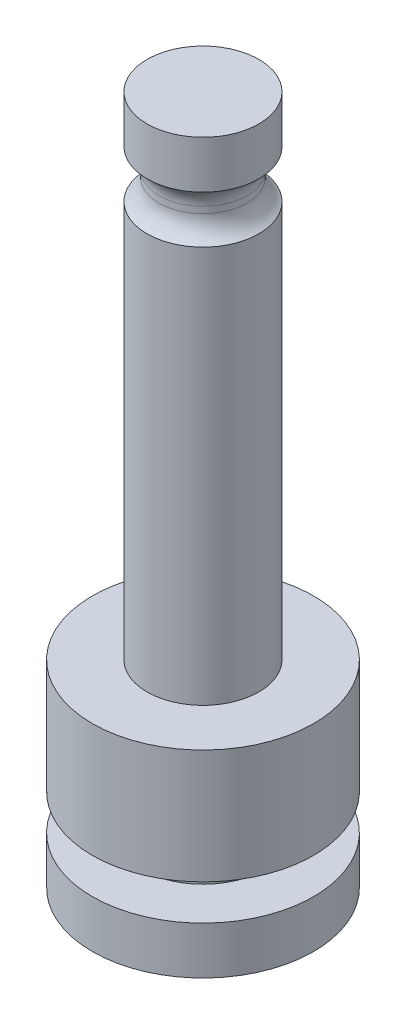
ISO-10303-21;
HEADER;
FILE_DESCRIPTION(('STEP AP214'),'2;1');
FILE_NAME('part.step','',(''),(''),'','','');
FILE_SCHEMA(('AUTOMOTIVE_DESIGN { 1 0 10303 214 1 1 1 1 }'));
ENDSEC;
DATA;
#1=APPLICATION_CONTEXT('core data for automotive mechanical design processes');
#2=APPLICATION_PROTOCOL_DEFINITION('international standard','automotive_design',2000,#1);
#3=PRODUCT_CONTEXT('',#1,'mechanical');
#4=PRODUCT('Part','Part','',(#3));
#5=PRODUCT_RELATED_PRODUCT_CATEGORY('part','',(#4));
#6=PRODUCT_DEFINITION_FORMATION('','',#4);
#7=PRODUCT_DEFINITION_CONTEXT('part definition',#1,'design');
#8=PRODUCT_DEFINITION('design','',#6,#7);
#9=PRODUCT_DEFINITION_SHAPE('','',#8);
#10=(LENGTH_UNIT() NAMED_UNIT(*) SI_UNIT(.MILLI.,.METRE.));
#11=(NAMED_UNIT(*) PLANE_ANGLE_UNIT() SI_UNIT($,.RADIAN.));
#12=(NAMED_UNIT(*) SI_UNIT($,.STERADIAN.) SOLID_ANGLE_UNIT());
#13=UNCERTAINTY_MEASURE_WITH_UNIT(LENGTH_MEASURE(1.E-05),#10,'distance_accuracy_value','');
#14=(GEOMETRIC_REPRESENTATION_CONTEXT(3) GLOBAL_UNCERTAINTY_ASSIGNED_CONTEXT((#13)) GLOBAL_UNIT_ASSIGNED_CONTEXT((#10,
#11,#12)) REPRESENTATION_CONTEXT('',''));
#15=CARTESIAN_POINT('',(0.,0.,0.));
#16=DIRECTION('',(0.,0.,1.));
#17=DIRECTION('',(1.,0.,0.));
#18=AXIS2_PLACEMENT_3D('',#15,#16,#17);
#19=CARTESIAN_POINT('',(0.,-4.,0.));
#20=DIRECTION('',(0.,1.,0.));
#21=DIRECTION('',(0.,0.,1.));
#22=AXIS2_PLACEMENT_3D('',#19,#20,#21);
#23=CYLINDRICAL_SURFACE('',#22,4.65);
#24=CARTESIAN_POINT('',(0.,4.3,0.));
#25=DIRECTION('',(0.,1.,0.));
#26=DIRECTION('',(0.,0.,1.));
#27=AXIS2_PLACEMENT_3D('',#24,#25,#26);
#28=CIRCLE('',#27,4.65);
#29=CARTESIAN_POINT('',(0.,4.3,4.65));
#30=VERTEX_POINT('',#29);
#31=EDGE_CURVE('E67',#30,#30,#28,.T.);
#32=ORIENTED_EDGE('',*,*,#31,.F.);
#33=EDGE_LOOP('',(#32));
#34=FACE_BOUND('',#33,.T.);
#35=CARTESIAN_POINT('',(0.,-0.5,0.));
#36=DIRECTION('',(0.,-1.,0.));
#37=DIRECTION('',(0.,0.,-1.));
#38=AXIS2_PLACEMENT_3D('',#35,#36,#37);
#39=CIRCLE('',#38,4.65);
#40=CARTESIAN_POINT('',(0.,-0.5,-4.65));
#41=VERTEX_POINT('',#40);
#42=EDGE_CURVE('E80',#41,#41,#39,.T.);
#43=ORIENTED_EDGE('',*,*,#42,.F.);
#44=EDGE_LOOP('',(#43));
#45=FACE_BOUND('',#44,.T.);
#46=ADVANCED_FACE('F43',(#34,#45),#23,.T.);
#47=CARTESIAN_POINT('',(0.,24.98,0.));
#48=DIRECTION('',(0.,-1.,0.));
#49=DIRECTION('',(0.,0.,-1.));
#50=AXIS2_PLACEMENT_3D('',#47,#48,#49);
#51=CYLINDRICAL_SURFACE('',#50,2.35);
#52=CARTESIAN_POINT('',(0.,4.3,0.));
#53=DIRECTION('',(0.,1.,0.));
#54=DIRECTION('',(0.,0.,1.));
#55=AXIS2_PLACEMENT_3D('',#52,#53,#54);
#56=CIRCLE('',#55,2.35);
#57=CARTESIAN_POINT('',(0.,4.3,2.35));
#58=VERTEX_POINT('',#57);
#59=EDGE_CURVE('E56',#58,#58,#56,.T.);
#60=ORIENTED_EDGE('',*,*,#59,.T.);
#61=EDGE_LOOP('',(#60));
#62=FACE_BOUND('',#61,.T.);
#63=CARTESIAN_POINT('',(0.,20.98,0.));
#64=DIRECTION('',(0.,1.,0.));
#65=DIRECTION('',(0.,0.,1.));
#66=AXIS2_PLACEMENT_3D('',#63,#64,#65);
#67=CIRCLE('',#66,2.35);
#68=CARTESIAN_POINT('',(0.,20.98,2.35));
#69=VERTEX_POINT('',#68);
#70=EDGE_CURVE('E75',#69,#69,#67,.T.);
#71=ORIENTED_EDGE('',*,*,#70,.F.);
#72=EDGE_LOOP('',(#71));
#73=FACE_BOUND('',#72,.T.);
#74=ADVANCED_FACE('F112',(#62,#73),#51,.T.);
#75=CARTESIAN_POINT('',(0.,4.3,0.));
#76=DIRECTION('',(0.,1.,0.));
#77=DIRECTION('',(0.,0.,1.));
#78=AXIS2_PLACEMENT_3D('',#75,#76,#77);
#79=PLANE('',#78);
#80=ORIENTED_EDGE('',*,*,#59,.F.);
#81=EDGE_LOOP('',(#80));
#82=FACE_BOUND('',#81,.T.);
#83=ORIENTED_EDGE('',*,*,#31,.T.);
#84=EDGE_LOOP('',(#83));
#85=FACE_BOUND('',#84,.T.);
#86=ADVANCED_FACE('F120',(#82,#85),#79,.T.);
#87=CARTESIAN_POINT('',(0.,20.98,0.));
#88=DIRECTION('',(0.,1.,0.));
#89=DIRECTION('',(0.,0.,1.));
#90=AXIS2_PLACEMENT_3D('',#87,#88,#89);
#91=CYLINDRICAL_SURFACE('',#90,1.85);
#92=CARTESIAN_POINT('',(0.,21.8460254037844,0.));
#93=DIRECTION('',(0.,-1.,0.));
#94=DIRECTION('',(0.,0.,-1.));
#95=AXIS2_PLACEMENT_3D('',#92,#93,#94);
#96=CIRCLE('',#95,1.85);
#97=CARTESIAN_POINT('',(0.,21.8460254037844,-1.85));
#98=VERTEX_POINT('',#97);
#99=EDGE_CURVE('E10',#98,#98,#96,.F.);
#100=ORIENTED_EDGE('',*,*,#99,.T.);
#101=EDGE_LOOP('',(#100));
#102=FACE_BOUND('',#101,.T.);
#103=CARTESIAN_POINT('',(0.,22.1139745962156,0.));
#104=DIRECTION('',(0.,1.,0.));
#105=DIRECTION('',(0.,0.,1.));
#106=AXIS2_PLACEMENT_3D('',#103,#104,#105);
#107=CIRCLE('',#106,1.85);
#108=CARTESIAN_POINT('',(0.,22.1139745962156,1.85));
#109=VERTEX_POINT('',#108);
#110=EDGE_CURVE('E51',#109,#109,#107,.F.);
#111=ORIENTED_EDGE('',*,*,#110,.T.);
#112=EDGE_LOOP('',(#111));
#113=FACE_BOUND('',#112,.T.);
#114=ADVANCED_FACE('F148',(#102,#113),#91,.T.);
#115=CARTESIAN_POINT('',(0.,24.98,0.));
#116=DIRECTION('',(0.,1.,0.));
#117=DIRECTION('',(0.,0.,1.));
#118=AXIS2_PLACEMENT_3D('',#115,#116,#117);
#119=PLANE('',#118);
#120=CARTESIAN_POINT('',(0.,24.98,0.));
#121=DIRECTION('',(0.,1.,0.));
#122=DIRECTION('',(0.,0.,1.));
#123=AXIS2_PLACEMENT_3D('',#120,#121,#122);
#124=CIRCLE('',#123,2.35);
#125=CARTESIAN_POINT('',(0.,24.98,2.35));
#126=VERTEX_POINT('',#125);
#127=EDGE_CURVE('E70',#126,#126,#124,.T.);
#128=ORIENTED_EDGE('',*,*,#127,.T.);
#129=EDGE_LOOP('',(#128));
#130=FACE_BOUND('',#129,.T.);
#131=ADVANCED_FACE('F150',(#130),#119,.T.);
#132=CARTESIAN_POINT('',(0.,22.98,0.));
#133=DIRECTION('',(0.,1.,0.));
#134=DIRECTION('',(0.,0.,1.));
#135=AXIS2_PLACEMENT_3D('',#132,#133,#134);
#136=CIRCLE('',#135,2.35);
#137=CARTESIAN_POINT('',(0.,22.98,2.35));
#138=VERTEX_POINT('',#137);
#139=EDGE_CURVE('E76',#138,#138,#136,.T.);
#140=ORIENTED_EDGE('',*,*,#139,.T.);
#141=EDGE_LOOP('',(#140));
#142=FACE_BOUND('',#141,.T.);
#143=ORIENTED_EDGE('',*,*,#127,.F.);
#144=EDGE_LOOP('',(#143));
#145=FACE_BOUND('',#144,.T.);
#146=ADVANCED_FACE('F107',(#142,#145),#51,.T.);
#147=CARTESIAN_POINT('',(0.,-0.5,0.));
#148=DIRECTION('',(0.,-1.,0.));
#149=DIRECTION('',(0.,0.,-1.));
#150=AXIS2_PLACEMENT_3D('',#147,#148,#149);
#151=PLANE('',#150);
#152=CARTESIAN_POINT('',(0.,-0.5,0.));
#153=DIRECTION('',(0.,-1.,0.));
#154=DIRECTION('',(0.,0.,-1.));
#155=AXIS2_PLACEMENT_3D('',#152,#153,#154);
#156=CIRCLE('',#155,2.65);
#157=CARTESIAN_POINT('',(0.,-0.5,-2.65));
#158=VERTEX_POINT('',#157);
#159=EDGE_CURVE('E88',#158,#158,#156,.T.);
#160=ORIENTED_EDGE('',*,*,#159,.F.);
#161=EDGE_LOOP('',(#160));
#162=FACE_BOUND('',#161,.T.);
#163=ORIENTED_EDGE('',*,*,#42,.T.);
#164=EDGE_LOOP('',(#163));
#165=FACE_BOUND('',#164,.T.);
#166=ADVANCED_FACE('F103',(#162,#165),#151,.T.);
#167=CARTESIAN_POINT('',(0.,-2.,0.));
#168=DIRECTION('',(0.,-1.,0.));
#169=DIRECTION('',(0.,0.,-1.));
#170=AXIS2_PLACEMENT_3D('',#167,#168,#169);
#171=PLANE('',#170);
#172=CARTESIAN_POINT('',(0.,-2.,0.));
#173=DIRECTION('',(0.,-1.,0.));
#174=DIRECTION('',(0.,0.,-1.));
#175=AXIS2_PLACEMENT_3D('',#172,#173,#174);
#176=CIRCLE('',#175,2.65);
#177=CARTESIAN_POINT('',(0.,-2.,-2.65));
#178=VERTEX_POINT('',#177);
#179=EDGE_CURVE('E92',#178,#178,#176,.T.);
#180=ORIENTED_EDGE('',*,*,#179,.T.);
#181=EDGE_LOOP('',(#180));
#182=FACE_BOUND('',#181,.T.);
#183=CARTESIAN_POINT('',(0.,-2.,0.));
#184=DIRECTION('',(0.,-1.,0.));
#185=DIRECTION('',(0.,0.,-1.));
#186=AXIS2_PLACEMENT_3D('',#183,#184,#185);
#187=CIRCLE('',#186,4.65);
#188=CARTESIAN_POINT('',(0.,-2.,-4.65));
#189=VERTEX_POINT('',#188);
#190=EDGE_CURVE('E84',#189,#189,#187,.T.);
#191=ORIENTED_EDGE('',*,*,#190,.F.);
#192=EDGE_LOOP('',(#191));
#193=FACE_BOUND('',#192,.T.);
#194=ADVANCED_FACE('F106',(#182,#193),#171,.F.);
#195=CARTESIAN_POINT('',(0.,-0.5,0.));
#196=DIRECTION('',(0.,-1.,0.));
#197=DIRECTION('',(0.,0.,-1.));
#198=AXIS2_PLACEMENT_3D('',#195,#196,#197);
#199=CYLINDRICAL_SURFACE('',#198,2.65);
#200=ORIENTED_EDGE('',*,*,#159,.T.);
#201=EDGE_LOOP('',(#200));
#202=FACE_BOUND('',#201,.T.);
#203=ORIENTED_EDGE('',*,*,#179,.F.);
#204=EDGE_LOOP('',(#203));
#205=FACE_BOUND('',#204,.T.);
#206=ADVANCED_FACE('F100',(#202,#205),#199,.T.);
#207=CARTESIAN_POINT('',(0.,-4.,0.));
#208=DIRECTION('',(0.,1.,0.));
#209=DIRECTION('',(0.,0.,1.));
#210=AXIS2_PLACEMENT_3D('',#207,#208,#209);
#211=PLANE('',#210);
#212=CARTESIAN_POINT('',(0.,-4.,0.));
#213=DIRECTION('',(0.,1.,0.));
#214=DIRECTION('',(0.,0.,1.));
#215=AXIS2_PLACEMENT_3D('',#212,#213,#214);
#216=CIRCLE('',#215,4.65);
#217=CARTESIAN_POINT('',(0.,-4.,4.65));
#218=VERTEX_POINT('',#217);
#219=EDGE_CURVE('E61',#218,#218,#216,.T.);
#220=ORIENTED_EDGE('',*,*,#219,.F.);
#221=EDGE_LOOP('',(#220));
#222=FACE_BOUND('',#221,.T.);
#223=ADVANCED_FACE('F127',(#222),#211,.F.);
#224=ORIENTED_EDGE('',*,*,#190,.T.);
#225=EDGE_LOOP('',(#224));
#226=FACE_BOUND('',#225,.T.);
#227=ORIENTED_EDGE('',*,*,#219,.T.);
#228=EDGE_LOOP('',(#227));
#229=FACE_BOUND('',#228,.T.);
#230=ADVANCED_FACE('F115',(#226,#229),#23,.T.);
#231=CARTESIAN_POINT('',(0.,21.8460254037844,0.));
#232=DIRECTION('',(0.,-1.,0.));
#233=DIRECTION('',(0.,0.,-1.));
#234=AXIS2_PLACEMENT_3D('',#231,#232,#233);
#235=TOROIDAL_SURFACE('',#234,2.85,1.);
#236=ORIENTED_EDGE('',*,*,#70,.T.);
#237=EDGE_LOOP('',(#236));
#238=FACE_BOUND('',#237,.T.);
#239=ORIENTED_EDGE('',*,*,#99,.F.);
#240=EDGE_LOOP('',(#239));
#241=FACE_BOUND('',#240,.T.);
#242=ADVANCED_FACE('F126',(#238,#241),#235,.F.);
#243=CARTESIAN_POINT('',(0.,22.1139745962156,0.));
#244=DIRECTION('',(0.,1.,0.));
#245=DIRECTION('',(0.,0.,1.));
#246=AXIS2_PLACEMENT_3D('',#243,#244,#245);
#247=TOROIDAL_SURFACE('',#246,2.85,1.);
#248=ORIENTED_EDGE('',*,*,#110,.F.);
#249=EDGE_LOOP('',(#248));
#250=FACE_BOUND('',#249,.T.);
#251=ORIENTED_EDGE('',*,*,#139,.F.);
#252=EDGE_LOOP('',(#251));
#253=FACE_BOUND('',#252,.T.);
#254=ADVANCED_FACE('F45',(#250,#253),#247,.F.);
#255=CLOSED_SHELL('',(#46,#74,#86,#114,#131,#146,#166,#194,#206,#223,#230,#242,#254));
#256=MANIFOLD_SOLID_BREP('B2',#255);
#257=ADVANCED_BREP_SHAPE_REPRESENTATION('',(#18,#256),#14);
#258=SHAPE_DEFINITION_REPRESENTATION(#9,#257);
ENDSEC;
END-ISO-10303-21;
